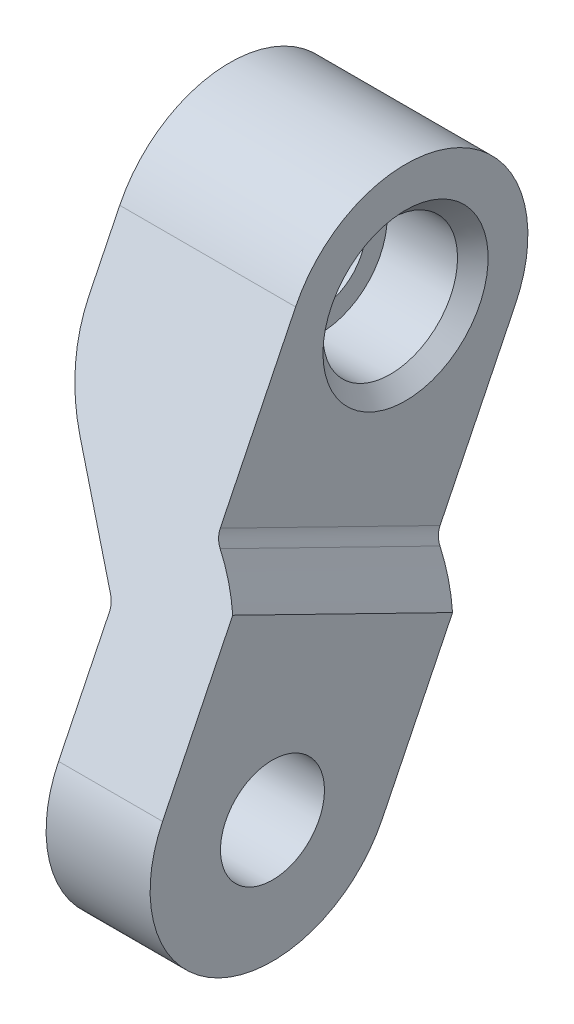
ISO-10303-21;
HEADER;
FILE_DESCRIPTION(('STEP AP214'),'2;1');
FILE_NAME('part.step','',(''),(''),'','','');
FILE_SCHEMA(('AUTOMOTIVE_DESIGN { 1 0 10303 214 1 1 1 1 }'));
ENDSEC;
DATA;
#1=APPLICATION_CONTEXT('core data for automotive mechanical design processes');
#2=APPLICATION_PROTOCOL_DEFINITION('international standard','automotive_design',2000,#1);
#3=PRODUCT_CONTEXT('',#1,'mechanical');
#4=PRODUCT('Part','Part','',(#3));
#5=PRODUCT_RELATED_PRODUCT_CATEGORY('part','',(#4));
#6=PRODUCT_DEFINITION_FORMATION('','',#4);
#7=PRODUCT_DEFINITION_CONTEXT('part definition',#1,'design');
#8=PRODUCT_DEFINITION('design','',#6,#7);
#9=PRODUCT_DEFINITION_SHAPE('','',#8);
#10=(LENGTH_UNIT() NAMED_UNIT(*) SI_UNIT(.MILLI.,.METRE.));
#11=(NAMED_UNIT(*) PLANE_ANGLE_UNIT() SI_UNIT($,.RADIAN.));
#12=(NAMED_UNIT(*) SI_UNIT($,.STERADIAN.) SOLID_ANGLE_UNIT());
#13=UNCERTAINTY_MEASURE_WITH_UNIT(LENGTH_MEASURE(1.E-05),#10,'distance_accuracy_value','');
#14=(GEOMETRIC_REPRESENTATION_CONTEXT(3) GLOBAL_UNCERTAINTY_ASSIGNED_CONTEXT((#13)) GLOBAL_UNIT_ASSIGNED_CONTEXT((#10,
#11,#12)) REPRESENTATION_CONTEXT('',''));
#15=CARTESIAN_POINT('',(0.,0.,0.));
#16=DIRECTION('',(0.,0.,1.));
#17=DIRECTION('',(1.,0.,0.));
#18=AXIS2_PLACEMENT_3D('',#15,#16,#17);
#19=CARTESIAN_POINT('',(-37.3463708891012,-55.7397843289757,-95.5929841698092));
#20=DIRECTION('',(0.,-0.439492943309417,-0.898246042452304));
#21=DIRECTION('',(0.,0.898246042452304,-0.439492943309417));
#22=AXIS2_PLACEMENT_3D('',#19,#20,#21);
#23=PLANE('',#22);
#24=DIRECTION('',(0.612716378008427,-0.709886433152947,0.347332538276535));
#25=VECTOR('',#24,1.);
#26=CARTESIAN_POINT('',(-37.3463708891012,-48.0917387878492,-99.3350123965717));
#27=LINE('',#26,#25);
#28=CARTESIAN_POINT('',(-36.2978852827237,-49.3065026395073,-98.7406539297828));
#29=VERTEX_POINT('',#28);
#30=CARTESIAN_POINT('',(-33.9721891618664,-52.0010284969675,-97.4222789590616));
#31=VERTEX_POINT('',#30);
#32=EDGE_CURVE('E273',#29,#31,#27,.T.);
#33=ORIENTED_EDGE('',*,*,#32,.F.);
#34=CARTESIAN_POINT('',(-32.3463708891012,-46.5546523310484,-100.087076551707));
#35=DIRECTION('',(0.,-0.439492943309417,-0.898246042452304));
#36=DIRECTION('',(0.,0.898246042452304,-0.439492943309417));
#37=AXIS2_PLACEMENT_3D('',#34,#35,#36);
#38=CIRCLE('',#37,5.);
#39=CARTESIAN_POINT('',(-37.3463708891012,-46.5546523310484,-100.087076551707));
#40=VERTEX_POINT('',#39);
#41=EDGE_CURVE('E198',#29,#40,#38,.T.);
#42=ORIENTED_EDGE('',*,*,#41,.T.);
#43=DIRECTION('',(0.,0.898246042452304,-0.439492943309417));
#44=VECTOR('',#43,1.);
#45=CARTESIAN_POINT('',(-37.3463708891012,-55.7397843289757,-95.5929841698092));
#46=LINE('',#45,#44);
#47=CARTESIAN_POINT('',(-37.3463708891012,-44.4987546180402,-101.092984169809));
#48=VERTEX_POINT('',#47);
#49=EDGE_CURVE('E170',#40,#48,#46,.T.);
#50=ORIENTED_EDGE('',*,*,#49,.T.);
#51=DIRECTION('',(1.,0.,0.));
#52=VECTOR('',#51,1.);
#53=CARTESIAN_POINT('',(-37.3463708891012,-44.4987546180402,-101.092984169809));
#54=LINE('',#53,#52);
#55=CARTESIAN_POINT('',(-31.5963708891012,-44.4987546180402,-101.092984169809));
#56=VERTEX_POINT('',#55);
#57=EDGE_CURVE('E159',#48,#56,#54,.T.);
#58=ORIENTED_EDGE('',*,*,#57,.T.);
#59=DIRECTION('',(0.,0.898246042452303,-0.439492943309417));
#60=VECTOR('',#59,1.);
#61=CARTESIAN_POINT('',(-31.5963708891012,-49.7728579990472,-98.5124760365267));
#62=LINE('',#61,#60);
#63=CARTESIAN_POINT('',(-31.5963708891012,-49.532939941584,-98.6298629085465));
#64=VERTEX_POINT('',#63);
#65=EDGE_CURVE('E143',#64,#56,#62,.T.);
#66=ORIENTED_EDGE('',*,*,#65,.F.);
#67=CARTESIAN_POINT('',(-30.9963708891012,-49.532939941584,-98.6298629085465));
#68=DIRECTION('',(0.,-0.439492943309417,-0.898246042452304));
#69=DIRECTION('',(0.,0.898246042452304,-0.439492943309417));
#70=AXIS2_PLACEMENT_3D('',#67,#68,#69);
#71=CIRCLE('',#70,0.6);
#72=CARTESIAN_POINT('',(-31.4087129933783,-49.924449512592,-98.4383054893494));
#73=VERTEX_POINT('',#72);
#74=EDGE_CURVE('E142',#64,#73,#71,.F.);
#75=ORIENTED_EDGE('',*,*,#74,.T.);
#76=CARTESIAN_POINT('',(-34.8448971956873,-53.1870292709925,-96.8419936627073));
#77=DIRECTION('',(0.,0.439492943309417,0.898246042452304));
#78=DIRECTION('',(0.,-0.898246042452304,0.439492943309417));
#79=AXIS2_PLACEMENT_3D('',#76,#77,#78);
#80=CIRCLE('',#79,5.);
#81=CARTESIAN_POINT('',(-30.4463708891012,-51.0513623950994,-97.8869306586468));
#82=VERTEX_POINT('',#81);
#83=EDGE_CURVE('E127',#82,#73,#80,.T.);
#84=ORIENTED_EDGE('',*,*,#83,.F.);
#85=DIRECTION('',(0.,0.898246042452304,-0.439492943309417));
#86=VECTOR('',#85,1.);
#87=CARTESIAN_POINT('',(-30.4463708891012,-55.7397843289757,-95.5929841698092));
#88=LINE('',#87,#86);
#89=CARTESIAN_POINT('',(-30.4463708891012,-55.7397843289757,-95.5929841698092));
#90=VERTEX_POINT('',#89);
#91=EDGE_CURVE('E140',#90,#82,#88,.T.);
#92=ORIENTED_EDGE('',*,*,#91,.F.);
#93=DIRECTION('',(1.,0.,0.));
#94=VECTOR('',#93,1.);
#95=CARTESIAN_POINT('',(-37.3463708891012,-55.7397843289757,-95.5929841698092));
#96=LINE('',#95,#94);
#97=CARTESIAN_POINT('',(-33.8463708891011,-55.7397843289757,-95.5929841698093));
#98=VERTEX_POINT('',#97);
#99=EDGE_CURVE('E162',#98,#90,#96,.T.);
#100=ORIENTED_EDGE('',*,*,#99,.F.);
#101=DIRECTION('',(0.,-0.898246042452303,0.439492943309418));
#102=VECTOR('',#101,1.);
#103=CARTESIAN_POINT('',(-33.8463708891011,-52.1468001591665,-97.350955943047));
#104=LINE('',#103,#102);
#105=CARTESIAN_POINT('',(-33.8463708891011,-52.3312505339826,-97.2607082444307));
#106=VERTEX_POINT('',#105);
#107=EDGE_CURVE('E252',#106,#98,#104,.T.);
#108=ORIENTED_EDGE('',*,*,#107,.F.);
#109=CARTESIAN_POINT('',(-34.4463708891011,-52.3312505339825,-97.2607082444307));
#110=DIRECTION('',(0.,-0.439492943309417,-0.898246042452304));
#111=DIRECTION('',(0.,0.898246042452304,-0.439492943309417));
#112=AXIS2_PLACEMENT_3D('',#109,#110,#111);
#113=CIRCLE('',#112,0.6);
#114=EDGE_CURVE('E188',#106,#31,#113,.F.);
#115=ORIENTED_EDGE('',*,*,#114,.T.);
#116=EDGE_LOOP('',(#33,#42,#50,#58,#66,#75,#84,#92,#100,#108,#115));
#117=FACE_BOUND('',#116,.T.);
#118=ADVANCED_FACE('F39',(#117),#23,.T.);
#119=CARTESIAN_POINT('',(-37.3463708891012,-40.9828110715648,-93.9070158301908));
#120=DIRECTION('',(0.,0.439492943309416,0.898246042452304));
#121=DIRECTION('',(0.,-0.898246042452304,0.439492943309416));
#122=AXIS2_PLACEMENT_3D('',#119,#120,#121);
#123=PLANE('',#122);
#124=DIRECTION('',(0.,-0.898246042452304,0.439492943309416));
#125=VECTOR('',#124,1.);
#126=CARTESIAN_POINT('',(-37.3463708891012,-40.9828110715648,-93.9070158301908));
#127=LINE('',#126,#125);
#128=CARTESIAN_POINT('',(-37.3463708891012,-40.9828110715648,-93.9070158301908));
#129=VERTEX_POINT('',#128);
#130=CARTESIAN_POINT('',(-37.3463708891012,-43.0387087845731,-92.9011082120884));
#131=VERTEX_POINT('',#130);
#132=EDGE_CURVE('E153',#129,#131,#127,.T.);
#133=ORIENTED_EDGE('',*,*,#132,.T.);
#134=CARTESIAN_POINT('',(-32.3463708891012,-43.0387087845731,-92.9011082120884));
#135=DIRECTION('',(0.,0.439492943309416,0.898246042452304));
#136=DIRECTION('',(0.,-0.898246042452304,0.439492943309416));
#137=AXIS2_PLACEMENT_3D('',#134,#135,#136);
#138=CIRCLE('',#137,5.);
#139=CARTESIAN_POINT('',(-36.2978852827237,-45.790559093032,-91.5546855901644));
#140=VERTEX_POINT('',#139);
#141=EDGE_CURVE('E63',#131,#140,#138,.T.);
#142=ORIENTED_EDGE('',*,*,#141,.T.);
#143=DIRECTION('',(-0.612716378008427,0.709886433152947,-0.347332538276536));
#144=VECTOR('',#143,1.);
#145=CARTESIAN_POINT('',(-39.283296958628,-42.331694074621,-93.2470356764517));
#146=LINE('',#145,#144);
#147=CARTESIAN_POINT('',(-33.9721891618664,-48.4850849504922,-90.2363106194432));
#148=VERTEX_POINT('',#147);
#149=EDGE_CURVE('E246',#148,#140,#146,.T.);
#150=ORIENTED_EDGE('',*,*,#149,.F.);
#151=CARTESIAN_POINT('',(-34.4463708891011,-48.8153069875072,-90.0747399048123));
#152=DIRECTION('',(0.,0.439492943309416,0.898246042452304));
#153=DIRECTION('',(0.,-0.898246042452304,0.439492943309416));
#154=AXIS2_PLACEMENT_3D('',#151,#152,#153);
#155=CIRCLE('',#154,0.6);
#156=CARTESIAN_POINT('',(-33.8463708891011,-48.8153069875072,-90.0747399048123));
#157=VERTEX_POINT('',#156);
#158=EDGE_CURVE('E191',#148,#157,#155,.F.);
#159=ORIENTED_EDGE('',*,*,#158,.T.);
#160=DIRECTION('',(0.,0.898246042452304,-0.439492943309416));
#161=VECTOR('',#160,1.);
#162=CARTESIAN_POINT('',(-33.8463708891011,-40.9828110715648,-93.9070158301908));
#163=LINE('',#162,#161);
#164=CARTESIAN_POINT('',(-33.8463708891011,-52.2238407825004,-88.4070158301908));
#165=VERTEX_POINT('',#164);
#166=EDGE_CURVE('E135',#165,#157,#163,.T.);
#167=ORIENTED_EDGE('',*,*,#166,.F.);
#168=DIRECTION('',(1.,0.,0.));
#169=VECTOR('',#168,1.);
#170=CARTESIAN_POINT('',(-37.3463708891012,-52.2238407825004,-88.4070158301908));
#171=LINE('',#170,#169);
#172=CARTESIAN_POINT('',(-30.4463708891012,-52.2238407825004,-88.4070158301908));
#173=VERTEX_POINT('',#172);
#174=EDGE_CURVE('E164',#165,#173,#171,.T.);
#175=ORIENTED_EDGE('',*,*,#174,.T.);
#176=DIRECTION('',(0.,-0.898246042452304,0.439492943309416));
#177=VECTOR('',#176,1.);
#178=CARTESIAN_POINT('',(-30.4463708891012,-40.9828110715648,-93.9070158301908));
#179=LINE('',#178,#177);
#180=CARTESIAN_POINT('',(-30.4463708891012,-47.5354188486241,-90.7009623190284));
#181=VERTEX_POINT('',#180);
#182=EDGE_CURVE('E155',#181,#173,#179,.T.);
#183=ORIENTED_EDGE('',*,*,#182,.F.);
#184=CARTESIAN_POINT('',(-34.8448971956873,-49.6710857245172,-89.6560253230889));
#185=DIRECTION('',(0.,0.439492943309416,0.898246042452304));
#186=DIRECTION('',(0.,-0.898246042452304,0.439492943309416));
#187=AXIS2_PLACEMENT_3D('',#184,#185,#186);
#188=CIRCLE('',#187,5.);
#189=CARTESIAN_POINT('',(-31.4087129933783,-46.4085059661167,-91.252337149731));
#190=VERTEX_POINT('',#189);
#191=EDGE_CURVE('E130',#190,#181,#188,.F.);
#192=ORIENTED_EDGE('',*,*,#191,.F.);
#193=CARTESIAN_POINT('',(-30.9963708891012,-46.0169963951087,-91.4438945689281));
#194=DIRECTION('',(0.,0.439492943309416,0.898246042452304));
#195=DIRECTION('',(0.,-0.898246042452304,0.439492943309416));
#196=AXIS2_PLACEMENT_3D('',#193,#194,#195);
#197=CIRCLE('',#196,0.6);
#198=CARTESIAN_POINT('',(-31.5963708891012,-46.0169963951087,-91.4438945689281));
#199=VERTEX_POINT('',#198);
#200=EDGE_CURVE('E186',#190,#199,#197,.F.);
#201=ORIENTED_EDGE('',*,*,#200,.T.);
#202=DIRECTION('',(0.,-0.898246042452304,0.439492943309416));
#203=VECTOR('',#202,1.);
#204=CARTESIAN_POINT('',(-31.5963708891012,-40.9828110715648,-93.9070158301908));
#205=LINE('',#204,#203);
#206=CARTESIAN_POINT('',(-31.5963708891012,-40.9828110715648,-93.9070158301908));
#207=VERTEX_POINT('',#206);
#208=EDGE_CURVE('E134',#207,#199,#205,.T.);
#209=ORIENTED_EDGE('',*,*,#208,.F.);
#210=DIRECTION('',(1.,0.,0.));
#211=VECTOR('',#210,1.);
#212=CARTESIAN_POINT('',(-37.3463708891012,-40.9828110715648,-93.9070158301908));
#213=LINE('',#212,#211);
#214=EDGE_CURVE('E167',#129,#207,#213,.T.);
#215=ORIENTED_EDGE('',*,*,#214,.F.);
#216=EDGE_LOOP('',(#133,#142,#150,#159,#167,#175,#183,#192,#201,#209,#215));
#217=FACE_BOUND('',#216,.T.);
#218=ADVANCED_FACE('F215',(#217),#123,.T.);
#219=CARTESIAN_POINT('',(-37.3463708891012,-42.7407828448025,-97.5));
#220=DIRECTION('',(1.,0.,0.));
#221=DIRECTION('',(0.,0.,-1.));
#222=AXIS2_PLACEMENT_3D('',#219,#220,#221);
#223=CYLINDRICAL_SURFACE('',#222,3.99999999999998);
#224=CARTESIAN_POINT('',(-31.5963708891012,-42.7407828448025,-97.5));
#225=DIRECTION('',(-1.,0.,0.));
#226=DIRECTION('',(0.,0.,1.));
#227=AXIS2_PLACEMENT_3D('',#224,#225,#226);
#228=CIRCLE('',#227,3.99999999999998);
#229=EDGE_CURVE('E265',#56,#207,#228,.F.);
#230=ORIENTED_EDGE('',*,*,#229,.F.);
#231=ORIENTED_EDGE('',*,*,#57,.F.);
#232=CARTESIAN_POINT('',(-37.3463708891012,-42.7407828448025,-97.5));
#233=DIRECTION('',(1.,0.,0.));
#234=DIRECTION('',(0.,0.,-1.));
#235=AXIS2_PLACEMENT_3D('',#232,#233,#234);
#236=CIRCLE('',#235,3.99999999999998);
#237=EDGE_CURVE('E150',#48,#129,#236,.T.);
#238=ORIENTED_EDGE('',*,*,#237,.T.);
#239=ORIENTED_EDGE('',*,*,#214,.T.);
#240=EDGE_LOOP('',(#230,#231,#238,#239));
#241=FACE_BOUND('',#240,.T.);
#242=ADVANCED_FACE('F220',(#241),#223,.T.);
#243=CARTESIAN_POINT('',(-37.3463708891012,-53.981812555738,-92.));
#244=DIRECTION('',(1.,0.,0.));
#245=DIRECTION('',(0.,0.,-1.));
#246=AXIS2_PLACEMENT_3D('',#243,#244,#245);
#247=CYLINDRICAL_SURFACE('',#246,3.99999999999998);
#248=CARTESIAN_POINT('',(-33.8463708891011,-53.981812555738,-92.));
#249=DIRECTION('',(1.,0.,0.));
#250=DIRECTION('',(0.,0.,-1.));
#251=AXIS2_PLACEMENT_3D('',#248,#249,#250);
#252=CIRCLE('',#251,3.99999999999998);
#253=EDGE_CURVE('E251',#98,#165,#252,.F.);
#254=ORIENTED_EDGE('',*,*,#253,.F.);
#255=ORIENTED_EDGE('',*,*,#99,.T.);
#256=CARTESIAN_POINT('',(-30.4463708891012,-53.981812555738,-92.));
#257=DIRECTION('',(1.,0.,0.));
#258=DIRECTION('',(0.,0.,-1.));
#259=AXIS2_PLACEMENT_3D('',#256,#257,#258);
#260=CIRCLE('',#259,3.99999999999998);
#261=EDGE_CURVE('E149',#173,#90,#260,.T.);
#262=ORIENTED_EDGE('',*,*,#261,.F.);
#263=ORIENTED_EDGE('',*,*,#174,.F.);
#264=EDGE_LOOP('',(#254,#255,#262,#263));
#265=FACE_BOUND('',#264,.T.);
#266=ADVANCED_FACE('F225',(#265),#247,.T.);
#267=CARTESIAN_POINT('',(-37.3463708891012,-42.7407828448025,-97.5));
#268=DIRECTION('',(1.,0.,0.));
#269=DIRECTION('',(0.,0.,-1.));
#270=AXIS2_PLACEMENT_3D('',#267,#268,#269);
#271=PLANE('',#270);
#272=CARTESIAN_POINT('',(-37.3463708891012,-42.7407828448025,-97.5));
#273=DIRECTION('',(1.,0.,0.));
#274=DIRECTION('',(0.,0.,-1.));
#275=AXIS2_PLACEMENT_3D('',#272,#273,#274);
#276=CIRCLE('',#275,1.50000000000002);
#277=CARTESIAN_POINT('',(-37.3463708891012,-42.7407828448025,-99.));
#278=VERTEX_POINT('',#277);
#279=EDGE_CURVE('E297',#278,#278,#276,.T.);
#280=ORIENTED_EDGE('',*,*,#279,.T.);
#281=EDGE_LOOP('',(#280));
#282=FACE_BOUND('',#281,.T.);
#283=ORIENTED_EDGE('',*,*,#49,.F.);
#284=DIRECTION('',(0.,0.439492943309417,0.898246042452304));
#285=VECTOR('',#284,1.);
#286=CARTESIAN_POINT('',(-37.3463708891012,-44.7966805578108,-96.4940923818976));
#287=LINE('',#286,#285);
#288=EDGE_CURVE('E193',#40,#131,#287,.T.);
#289=ORIENTED_EDGE('',*,*,#288,.T.);
#290=ORIENTED_EDGE('',*,*,#132,.F.);
#291=ORIENTED_EDGE('',*,*,#237,.F.);
#292=EDGE_LOOP('',(#283,#289,#290,#291));
#293=FACE_BOUND('',#292,.T.);
#294=ADVANCED_FACE('F227',(#282,#293),#271,.F.);
#295=CARTESIAN_POINT('',(-30.4463708891012,-42.7407828448025,-97.5));
#296=DIRECTION('',(1.,0.,0.));
#297=DIRECTION('',(0.,0.,-1.));
#298=AXIS2_PLACEMENT_3D('',#295,#296,#297);
#299=PLANE('',#298);
#300=CARTESIAN_POINT('',(-30.4463708891012,-53.981812555738,-92.));
#301=DIRECTION('',(1.,0.,0.));
#302=DIRECTION('',(0.,0.,-1.));
#303=AXIS2_PLACEMENT_3D('',#300,#301,#302);
#304=CIRCLE('',#303,1.70000000000001);
#305=CARTESIAN_POINT('',(-30.4463708891012,-53.981812555738,-93.7));
#306=VERTEX_POINT('',#305);
#307=EDGE_CURVE('E299',#306,#306,#304,.T.);
#308=ORIENTED_EDGE('',*,*,#307,.F.);
#309=EDGE_LOOP('',(#308));
#310=FACE_BOUND('',#309,.T.);
#311=DIRECTION('',(0.,-0.439492943309417,-0.898246042452304));
#312=VECTOR('',#311,1.);
#313=CARTESIAN_POINT('',(-30.4463708891012,-44.7704328613594,-85.0498187493624));
#314=LINE('',#313,#312);
#315=EDGE_CURVE('E124',#181,#82,#314,.T.);
#316=ORIENTED_EDGE('',*,*,#315,.F.);
#317=ORIENTED_EDGE('',*,*,#182,.T.);
#318=ORIENTED_EDGE('',*,*,#261,.T.);
#319=ORIENTED_EDGE('',*,*,#91,.T.);
#320=EDGE_LOOP('',(#316,#317,#318,#319));
#321=FACE_BOUND('',#320,.T.);
#322=ADVANCED_FACE('F147',(#310,#321),#299,.T.);
#323=CARTESIAN_POINT('',(-33.8463708891011,-45.8658706254264,-84.5138440337625));
#324=DIRECTION('',(1.,0.,0.));
#325=DIRECTION('',(0.,0.,-1.));
#326=AXIS2_PLACEMENT_3D('',#323,#324,#325);
#327=PLANE('',#326);
#328=CARTESIAN_POINT('',(-33.8463708891011,-53.981812555738,-92.));
#329=DIRECTION('',(1.,0.,0.));
#330=DIRECTION('',(0.,0.,-1.));
#331=AXIS2_PLACEMENT_3D('',#328,#329,#330);
#332=CIRCLE('',#331,1.70000000000001);
#333=CARTESIAN_POINT('',(-33.8463708891011,-53.981812555738,-93.7));
#334=VERTEX_POINT('',#333);
#335=EDGE_CURVE('E144',#334,#334,#332,.T.);
#336=ORIENTED_EDGE('',*,*,#335,.T.);
#337=EDGE_LOOP('',(#336));
#338=FACE_BOUND('',#337,.T.);
#339=ORIENTED_EDGE('',*,*,#166,.T.);
#340=DIRECTION('',(0.,-0.439492943309417,-0.898246042452304));
#341=VECTOR('',#340,1.);
#342=CARTESIAN_POINT('',(-33.8463708891011,-52.3312505339826,-97.2607082444307));
#343=LINE('',#342,#341);
#344=EDGE_CURVE('E180',#157,#106,#343,.T.);
#345=ORIENTED_EDGE('',*,*,#344,.T.);
#346=ORIENTED_EDGE('',*,*,#107,.T.);
#347=ORIENTED_EDGE('',*,*,#253,.T.);
#348=EDGE_LOOP('',(#339,#345,#346,#347));
#349=FACE_BOUND('',#348,.T.);
#350=ADVANCED_FACE('F248',(#338,#349),#327,.F.);
#351=CARTESIAN_POINT('',(-37.3463708891012,-41.8108092541092,-86.4979004872872));
#352=DIRECTION('',(0.790302878724502,0.550370061691779,-0.269284524384809));
#353=DIRECTION('',(-0.571480158579942,0.820615883559077,0.));
#354=AXIS2_PLACEMENT_3D('',#351,#352,#353);
#355=PLANE('',#354);
#356=ORIENTED_EDGE('',*,*,#149,.T.);
#357=DIRECTION('',(0.,0.439492943309417,0.898246042452304));
#358=VECTOR('',#357,1.);
#359=CARTESIAN_POINT('',(-36.2978852827237,-43.0255731057673,-85.9035420204984));
#360=LINE('',#359,#358);
#361=EDGE_CURVE('E55',#140,#29,#360,.F.);
#362=ORIENTED_EDGE('',*,*,#361,.T.);
#363=ORIENTED_EDGE('',*,*,#32,.T.);
#364=DIRECTION('',(0.,-0.439492943309417,-0.898246042452304));
#365=VECTOR('',#364,1.);
#366=CARTESIAN_POINT('',(-33.9721891618664,-48.4850849504921,-90.2363106194431));
#367=LINE('',#366,#365);
#368=EDGE_CURVE('E183',#31,#148,#367,.F.);
#369=ORIENTED_EDGE('',*,*,#368,.T.);
#370=EDGE_LOOP('',(#356,#362,#363,#369));
#371=FACE_BOUND('',#370,.T.);
#372=ADVANCED_FACE('F277',(#371),#355,.F.);
#373=CARTESIAN_POINT('',(-31.5963708891012,-43.4919284653072,-85.6753641272423));
#374=DIRECTION('',(-1.,0.,0.));
#375=DIRECTION('',(0.,0.,1.));
#376=AXIS2_PLACEMENT_3D('',#373,#374,#375);
#377=PLANE('',#376);
#378=CARTESIAN_POINT('',(-31.5963708891012,-42.7407828448025,-97.5));
#379=DIRECTION('',(-1.,0.,0.));
#380=DIRECTION('',(0.,0.,1.));
#381=AXIS2_PLACEMENT_3D('',#378,#379,#380);
#382=CIRCLE('',#381,2.70000000000002);
#383=CARTESIAN_POINT('',(-31.5963708891012,-42.7407828448025,-94.8));
#384=VERTEX_POINT('',#383);
#385=EDGE_CURVE('E11',#384,#384,#382,.T.);
#386=ORIENTED_EDGE('',*,*,#385,.T.);
#387=EDGE_LOOP('',(#386));
#388=FACE_BOUND('',#387,.T.);
#389=ORIENTED_EDGE('',*,*,#208,.T.);
#390=DIRECTION('',(0.,0.439492943309417,0.898246042452304));
#391=VECTOR('',#390,1.);
#392=CARTESIAN_POINT('',(-31.5963708891012,-49.532939941584,-98.6298629085465));
#393=LINE('',#392,#391);
#394=EDGE_CURVE('E175',#199,#64,#393,.F.);
#395=ORIENTED_EDGE('',*,*,#394,.T.);
#396=ORIENTED_EDGE('',*,*,#65,.T.);
#397=ORIENTED_EDGE('',*,*,#229,.T.);
#398=EDGE_LOOP('',(#389,#395,#396,#397));
#399=FACE_BOUND('',#398,.T.);
#400=ADVANCED_FACE('F271',(#388,#399),#377,.F.);
#401=CARTESIAN_POINT('',(-34.8448971956873,-46.9060997372525,-84.0048817534229));
#402=DIRECTION('',(0.,-0.439492943309417,-0.898246042452304));
#403=DIRECTION('',(0.,0.898246042452304,-0.439492943309417));
#404=AXIS2_PLACEMENT_3D('',#401,#402,#403);
#405=CYLINDRICAL_SURFACE('',#404,5.);
#406=ORIENTED_EDGE('',*,*,#83,.T.);
#407=DIRECTION('',(0.,-0.439492943309417,-0.898246042452304));
#408=VECTOR('',#407,1.);
#409=CARTESIAN_POINT('',(-31.4087129933783,-43.643519978852,-85.601193580065));
#410=LINE('',#409,#408);
#411=EDGE_CURVE('E178',#73,#190,#410,.F.);
#412=ORIENTED_EDGE('',*,*,#411,.T.);
#413=ORIENTED_EDGE('',*,*,#191,.T.);
#414=ORIENTED_EDGE('',*,*,#315,.T.);
#415=EDGE_LOOP('',(#406,#412,#413,#414));
#416=FACE_BOUND('',#415,.T.);
#417=ADVANCED_FACE('F126',(#416),#405,.T.);
#418=CARTESIAN_POINT('',(-30.4463708891012,-53.981812555738,-92.));
#419=DIRECTION('',(1.,0.,0.));
#420=DIRECTION('',(0.,0.,-1.));
#421=AXIS2_PLACEMENT_3D('',#418,#419,#420);
#422=CYLINDRICAL_SURFACE('',#421,1.70000000000001);
#423=ORIENTED_EDGE('',*,*,#335,.F.);
#424=EDGE_LOOP('',(#423));
#425=FACE_BOUND('',#424,.T.);
#426=ORIENTED_EDGE('',*,*,#307,.T.);
#427=EDGE_LOOP('',(#426));
#428=FACE_BOUND('',#427,.T.);
#429=ADVANCED_FACE('F312',(#425,#428),#422,.F.);
#430=CARTESIAN_POINT('',(-31.5963708891012,-42.7407828448025,-97.5));
#431=DIRECTION('',(1.,0.,0.));
#432=DIRECTION('',(0.,0.,-1.));
#433=AXIS2_PLACEMENT_3D('',#430,#431,#432);
#434=CYLINDRICAL_SURFACE('',#433,1.50000000000002);
#435=ORIENTED_EDGE('',*,*,#279,.F.);
#436=EDGE_LOOP('',(#435));
#437=FACE_BOUND('',#436,.T.);
#438=CARTESIAN_POINT('',(-34.3963708891011,-42.7407828448025,-97.5));
#439=DIRECTION('',(1.,0.,0.));
#440=DIRECTION('',(0.,0.,-1.));
#441=AXIS2_PLACEMENT_3D('',#438,#439,#440);
#442=CIRCLE('',#441,1.50000000000002);
#443=CARTESIAN_POINT('',(-34.3963708891011,-42.7407828448025,-99.));
#444=VERTEX_POINT('',#443);
#445=EDGE_CURVE('E300',#444,#444,#442,.T.);
#446=ORIENTED_EDGE('',*,*,#445,.T.);
#447=EDGE_LOOP('',(#446));
#448=FACE_BOUND('',#447,.T.);
#449=ADVANCED_FACE('F315',(#437,#448),#434,.F.);
#450=CARTESIAN_POINT('',(-34.3963708891011,-41.2407828448025,-97.5));
#451=DIRECTION('',(-1.,0.,0.));
#452=DIRECTION('',(0.,0.,1.));
#453=AXIS2_PLACEMENT_3D('',#450,#451,#452);
#454=PLANE('',#453);
#455=ORIENTED_EDGE('',*,*,#445,.F.);
#456=EDGE_LOOP('',(#455));
#457=FACE_BOUND('',#456,.T.);
#458=CARTESIAN_POINT('',(-34.3963708891011,-42.7407828448025,-97.5));
#459=DIRECTION('',(1.,0.,0.));
#460=DIRECTION('',(0.,0.,-1.));
#461=AXIS2_PLACEMENT_3D('',#458,#459,#460);
#462=CIRCLE('',#461,2.20000000000001);
#463=CARTESIAN_POINT('',(-34.3963708891011,-42.7407828448025,-99.7));
#464=VERTEX_POINT('',#463);
#465=EDGE_CURVE('E305',#464,#464,#462,.T.);
#466=ORIENTED_EDGE('',*,*,#465,.T.);
#467=EDGE_LOOP('',(#466));
#468=FACE_BOUND('',#467,.T.);
#469=ADVANCED_FACE('F322',(#457,#468),#454,.F.);
#470=CARTESIAN_POINT('',(-31.5963708891012,-42.7407828448025,-97.5));
#471=DIRECTION('',(1.,0.,0.));
#472=DIRECTION('',(0.,0.,-1.));
#473=AXIS2_PLACEMENT_3D('',#470,#471,#472);
#474=CYLINDRICAL_SURFACE('',#473,2.20000000000001);
#475=CARTESIAN_POINT('',(-32.0963708891012,-42.7407828448025,-97.5));
#476=DIRECTION('',(-1.,0.,0.));
#477=DIRECTION('',(0.,0.,1.));
#478=AXIS2_PLACEMENT_3D('',#475,#476,#477);
#479=CIRCLE('',#478,2.20000000000001);
#480=CARTESIAN_POINT('',(-32.0963708891012,-42.7407828448025,-95.3));
#481=VERTEX_POINT('',#480);
#482=EDGE_CURVE('E48',#481,#481,#479,.F.);
#483=ORIENTED_EDGE('',*,*,#482,.T.);
#484=EDGE_LOOP('',(#483));
#485=FACE_BOUND('',#484,.T.);
#486=ORIENTED_EDGE('',*,*,#465,.F.);
#487=EDGE_LOOP('',(#486));
#488=FACE_BOUND('',#487,.T.);
#489=ADVANCED_FACE('F202',(#485,#488),#474,.F.);
#490=CARTESIAN_POINT('',(-30.9963708891012,-43.252010407844,-85.7927509992621));
#491=DIRECTION('',(0.,-0.439492943309417,-0.898246042452304));
#492=DIRECTION('',(0.,0.898246042452304,-0.439492943309417));
#493=AXIS2_PLACEMENT_3D('',#490,#491,#492);
#494=CYLINDRICAL_SURFACE('',#493,0.6);
#495=ORIENTED_EDGE('',*,*,#200,.F.);
#496=ORIENTED_EDGE('',*,*,#411,.F.);
#497=ORIENTED_EDGE('',*,*,#74,.F.);
#498=ORIENTED_EDGE('',*,*,#394,.F.);
#499=EDGE_LOOP('',(#495,#496,#497,#498));
#500=FACE_BOUND('',#499,.T.);
#501=ADVANCED_FACE('F233',(#500),#494,.F.);
#502=CARTESIAN_POINT('',(-34.4463708891011,-46.0503210002425,-84.4235963351463));
#503=DIRECTION('',(0.,0.439492943309417,0.898246042452304));
#504=DIRECTION('',(0.,-0.898246042452304,0.439492943309417));
#505=AXIS2_PLACEMENT_3D('',#502,#503,#504);
#506=CYLINDRICAL_SURFACE('',#505,0.6);
#507=ORIENTED_EDGE('',*,*,#158,.F.);
#508=ORIENTED_EDGE('',*,*,#368,.F.);
#509=ORIENTED_EDGE('',*,*,#114,.F.);
#510=ORIENTED_EDGE('',*,*,#344,.F.);
#511=EDGE_LOOP('',(#507,#508,#509,#510));
#512=FACE_BOUND('',#511,.T.);
#513=ADVANCED_FACE('F211',(#512),#506,.F.);
#514=CARTESIAN_POINT('',(-32.3463708891012,-44.7966805578108,-96.4940923818976));
#515=DIRECTION('',(0.,0.439492943309417,0.898246042452304));
#516=DIRECTION('',(0.,-0.898246042452304,0.439492943309417));
#517=AXIS2_PLACEMENT_3D('',#514,#515,#516);
#518=CYLINDRICAL_SURFACE('',#517,5.);
#519=ORIENTED_EDGE('',*,*,#41,.F.);
#520=ORIENTED_EDGE('',*,*,#361,.F.);
#521=ORIENTED_EDGE('',*,*,#141,.F.);
#522=ORIENTED_EDGE('',*,*,#288,.F.);
#523=EDGE_LOOP('',(#519,#520,#521,#522));
#524=FACE_BOUND('',#523,.T.);
#525=ADVANCED_FACE('F206',(#524),#518,.T.);
#526=CARTESIAN_POINT('',(-32.0963708891012,-42.7407828448025,-97.5));
#527=DIRECTION('',(1.,0.,0.));
#528=DIRECTION('',(0.,0.,-1.));
#529=AXIS2_PLACEMENT_3D('',#526,#527,#528);
#530=CONICAL_SURFACE('',#529,2.20000000000001,0.785398163397448);
#531=ORIENTED_EDGE('',*,*,#385,.F.);
#532=EDGE_LOOP('',(#531));
#533=FACE_BOUND('',#532,.T.);
#534=ORIENTED_EDGE('',*,*,#482,.F.);
#535=EDGE_LOOP('',(#534));
#536=FACE_BOUND('',#535,.T.);
#537=ADVANCED_FACE('F42',(#533,#536),#530,.F.);
#538=CLOSED_SHELL('',(#118,#218,#242,#266,#294,#322,#350,#372,#400,#417,#429,#449,#469,#489,
#501,#513,#525,#537));
#539=MANIFOLD_SOLID_BREP('B2',#538);
#540=ADVANCED_BREP_SHAPE_REPRESENTATION('',(#18,#539),#14);
#541=SHAPE_DEFINITION_REPRESENTATION(#9,#540);
ENDSEC;
END-ISO-10303-21;
